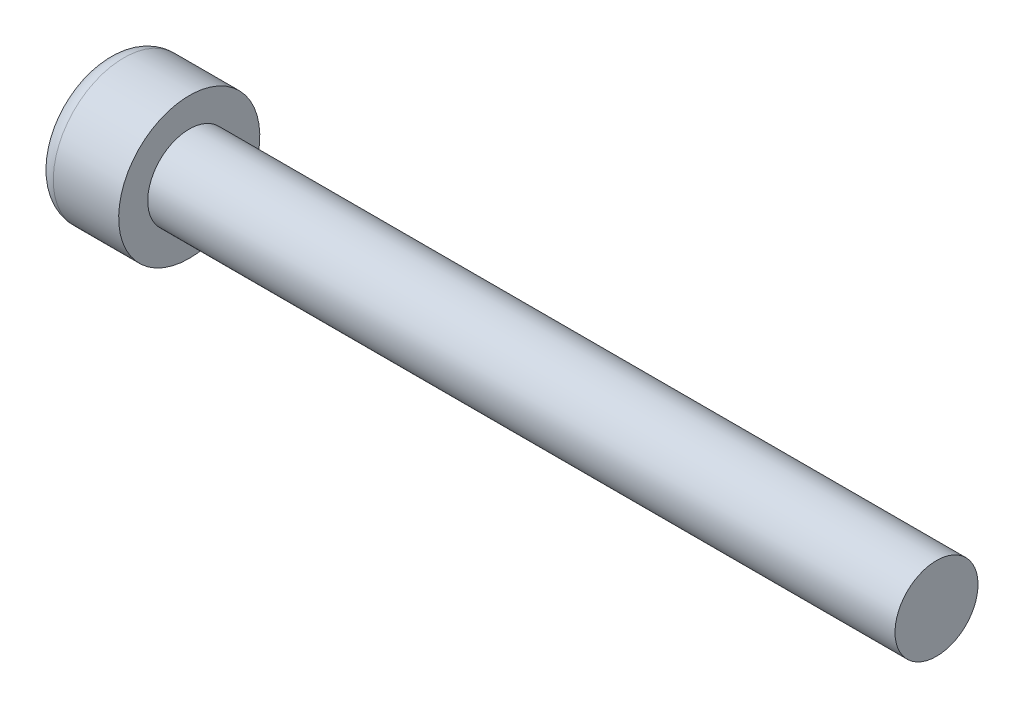
ISO-10303-21;
HEADER;
FILE_DESCRIPTION(('STEP AP214'),'2;1');
FILE_NAME('part.step','',(''),(''),'','','');
FILE_SCHEMA(('AUTOMOTIVE_DESIGN { 1 0 10303 214 1 1 1 1 }'));
ENDSEC;
DATA;
#1=APPLICATION_CONTEXT('core data for automotive mechanical design processes');
#2=APPLICATION_PROTOCOL_DEFINITION('international standard','automotive_design',2000,#1);
#3=PRODUCT_CONTEXT('',#1,'mechanical');
#4=PRODUCT('Part','Part','',(#3));
#5=PRODUCT_RELATED_PRODUCT_CATEGORY('part','',(#4));
#6=PRODUCT_DEFINITION_FORMATION('','',#4);
#7=PRODUCT_DEFINITION_CONTEXT('part definition',#1,'design');
#8=PRODUCT_DEFINITION('design','',#6,#7);
#9=PRODUCT_DEFINITION_SHAPE('','',#8);
#10=(LENGTH_UNIT() NAMED_UNIT(*) SI_UNIT(.MILLI.,.METRE.));
#11=(NAMED_UNIT(*) PLANE_ANGLE_UNIT() SI_UNIT($,.RADIAN.));
#12=(NAMED_UNIT(*) SI_UNIT($,.STERADIAN.) SOLID_ANGLE_UNIT());
#13=UNCERTAINTY_MEASURE_WITH_UNIT(LENGTH_MEASURE(1.E-05),#10,'distance_accuracy_value','');
#14=(GEOMETRIC_REPRESENTATION_CONTEXT(3) GLOBAL_UNCERTAINTY_ASSIGNED_CONTEXT((#13)) GLOBAL_UNIT_ASSIGNED_CONTEXT((#10,
#11,#12)) REPRESENTATION_CONTEXT('',''));
#15=CARTESIAN_POINT('',(0.,0.,0.));
#16=DIRECTION('',(0.,0.,1.));
#17=DIRECTION('',(1.,0.,0.));
#18=AXIS2_PLACEMENT_3D('',#15,#16,#17);
#19=CARTESIAN_POINT('',(0.,0.,0.));
#20=DIRECTION('',(1.,0.,0.));
#21=DIRECTION('',(0.,1.,0.));
#22=AXIS2_PLACEMENT_3D('',#19,#20,#21);
#23=PLANE('',#22);
#24=DIRECTION('',(0.,-0.5,-0.866025403784439));
#25=VECTOR('',#24,1.);
#26=CARTESIAN_POINT('',(0.,2.3094010767585,0.));
#27=LINE('',#26,#25);
#28=CARTESIAN_POINT('',(0.,2.3094010767585,0.));
#29=VERTEX_POINT('',#28);
#30=CARTESIAN_POINT('',(0.,1.15470053837925,-2.));
#31=VERTEX_POINT('',#30);
#32=EDGE_CURVE('E121',#29,#31,#27,.T.);
#33=ORIENTED_EDGE('',*,*,#32,.F.);
#34=DIRECTION('',(0.,0.5,-0.866025403784439));
#35=VECTOR('',#34,1.);
#36=CARTESIAN_POINT('',(0.,1.15470053837925,2.));
#37=LINE('',#36,#35);
#38=CARTESIAN_POINT('',(0.,1.15470053837925,2.));
#39=VERTEX_POINT('',#38);
#40=EDGE_CURVE('E47',#39,#29,#37,.T.);
#41=ORIENTED_EDGE('',*,*,#40,.F.);
#42=DIRECTION('',(0.,1.,0.));
#43=VECTOR('',#42,1.);
#44=CARTESIAN_POINT('',(0.,-1.15470053837925,2.));
#45=LINE('',#44,#43);
#46=CARTESIAN_POINT('',(0.,-1.15470053837925,2.));
#47=VERTEX_POINT('',#46);
#48=EDGE_CURVE('E130',#47,#39,#45,.T.);
#49=ORIENTED_EDGE('',*,*,#48,.F.);
#50=DIRECTION('',(0.,0.5,0.866025403784439));
#51=VECTOR('',#50,1.);
#52=CARTESIAN_POINT('',(0.,-2.3094010767585,0.));
#53=LINE('',#52,#51);
#54=CARTESIAN_POINT('',(0.,-2.3094010767585,0.));
#55=VERTEX_POINT('',#54);
#56=EDGE_CURVE('E128',#55,#47,#53,.T.);
#57=ORIENTED_EDGE('',*,*,#56,.F.);
#58=DIRECTION('',(0.,-0.5,0.866025403784439));
#59=VECTOR('',#58,1.);
#60=CARTESIAN_POINT('',(0.,-1.15470053837925,-2.));
#61=LINE('',#60,#59);
#62=CARTESIAN_POINT('',(0.,-1.15470053837925,-2.));
#63=VERTEX_POINT('',#62);
#64=EDGE_CURVE('E95',#63,#55,#61,.T.);
#65=ORIENTED_EDGE('',*,*,#64,.F.);
#66=DIRECTION('',(0.,-1.,0.));
#67=VECTOR('',#66,1.);
#68=CARTESIAN_POINT('',(0.,1.15470053837925,-2.));
#69=LINE('',#68,#67);
#70=EDGE_CURVE('E124',#31,#63,#69,.T.);
#71=ORIENTED_EDGE('',*,*,#70,.F.);
#72=EDGE_LOOP('',(#33,#41,#49,#57,#65,#71));
#73=FACE_BOUND('',#72,.T.);
#74=CARTESIAN_POINT('',(0.,0.,0.));
#75=DIRECTION('',(-1.,0.,0.));
#76=DIRECTION('',(0.,-1.,0.));
#77=AXIS2_PLACEMENT_3D('',#74,#75,#76);
#78=CIRCLE('',#77,3.1875);
#79=CARTESIAN_POINT('',(0.,-3.1875,0.));
#80=VERTEX_POINT('',#79);
#81=EDGE_CURVE('E11',#80,#80,#78,.T.);
#82=ORIENTED_EDGE('',*,*,#81,.T.);
#83=EDGE_LOOP('',(#82));
#84=FACE_BOUND('',#83,.T.);
#85=ADVANCED_FACE('F33',(#73,#84),#23,.F.);
#86=CARTESIAN_POINT('',(1.0625,0.,0.));
#87=DIRECTION('',(-1.,0.,0.));
#88=DIRECTION('',(0.,-1.,0.));
#89=AXIS2_PLACEMENT_3D('',#86,#87,#88);
#90=TOROIDAL_SURFACE('',#89,3.1875,1.0625);
#91=ORIENTED_EDGE('',*,*,#81,.F.);
#92=EDGE_LOOP('',(#91));
#93=FACE_BOUND('',#92,.T.);
#94=CARTESIAN_POINT('',(1.0625,0.,0.));
#95=DIRECTION('',(-1.,0.,0.));
#96=DIRECTION('',(0.,-1.,0.));
#97=AXIS2_PLACEMENT_3D('',#94,#95,#96);
#98=CIRCLE('',#97,4.25);
#99=CARTESIAN_POINT('',(1.0625,-4.25,0.));
#100=VERTEX_POINT('',#99);
#101=EDGE_CURVE('E40',#100,#100,#98,.T.);
#102=ORIENTED_EDGE('',*,*,#101,.T.);
#103=EDGE_LOOP('',(#102));
#104=FACE_BOUND('',#103,.T.);
#105=ADVANCED_FACE('F150',(#93,#104),#90,.T.);
#106=CARTESIAN_POINT('',(0.,0.,0.));
#107=DIRECTION('',(-1.,0.,0.));
#108=DIRECTION('',(0.,-1.,0.));
#109=AXIS2_PLACEMENT_3D('',#106,#107,#108);
#110=CYLINDRICAL_SURFACE('',#109,4.25);
#111=ORIENTED_EDGE('',*,*,#101,.F.);
#112=EDGE_LOOP('',(#111));
#113=FACE_BOUND('',#112,.T.);
#114=CARTESIAN_POINT('',(5.,0.,0.));
#115=DIRECTION('',(-1.,0.,0.));
#116=DIRECTION('',(0.,-1.,0.));
#117=AXIS2_PLACEMENT_3D('',#114,#115,#116);
#118=CIRCLE('',#117,4.25);
#119=CARTESIAN_POINT('',(5.,-4.25,0.));
#120=VERTEX_POINT('',#119);
#121=EDGE_CURVE('E145',#120,#120,#118,.T.);
#122=ORIENTED_EDGE('',*,*,#121,.T.);
#123=EDGE_LOOP('',(#122));
#124=FACE_BOUND('',#123,.T.);
#125=ADVANCED_FACE('F152',(#113,#124),#110,.T.);
#126=CARTESIAN_POINT('',(5.,4.25,0.));
#127=DIRECTION('',(-1.,0.,0.));
#128=DIRECTION('',(0.,-1.,0.));
#129=AXIS2_PLACEMENT_3D('',#126,#127,#128);
#130=PLANE('',#129);
#131=ORIENTED_EDGE('',*,*,#121,.F.);
#132=EDGE_LOOP('',(#131));
#133=FACE_BOUND('',#132,.T.);
#134=CARTESIAN_POINT('',(5.,0.,0.));
#135=DIRECTION('',(-1.,0.,0.));
#136=DIRECTION('',(0.,-1.,0.));
#137=AXIS2_PLACEMENT_3D('',#134,#135,#136);
#138=CIRCLE('',#137,2.5);
#139=CARTESIAN_POINT('',(5.,-2.5,0.));
#140=VERTEX_POINT('',#139);
#141=EDGE_CURVE('E142',#140,#140,#138,.T.);
#142=ORIENTED_EDGE('',*,*,#141,.T.);
#143=EDGE_LOOP('',(#142));
#144=FACE_BOUND('',#143,.T.);
#145=ADVANCED_FACE('F155',(#133,#144),#130,.F.);
#146=CARTESIAN_POINT('',(0.,0.,0.));
#147=DIRECTION('',(-1.,0.,0.));
#148=DIRECTION('',(0.,-1.,0.));
#149=AXIS2_PLACEMENT_3D('',#146,#147,#148);
#150=CYLINDRICAL_SURFACE('',#149,2.49999999999999);
#151=ORIENTED_EDGE('',*,*,#141,.F.);
#152=EDGE_LOOP('',(#151));
#153=FACE_BOUND('',#152,.T.);
#154=CARTESIAN_POINT('',(50.,0.,0.));
#155=DIRECTION('',(-1.,0.,0.));
#156=DIRECTION('',(0.,-1.,0.));
#157=AXIS2_PLACEMENT_3D('',#154,#155,#156);
#158=CIRCLE('',#157,2.49999999999999);
#159=CARTESIAN_POINT('',(50.,-2.49999999999998,0.));
#160=VERTEX_POINT('',#159);
#161=EDGE_CURVE('E134',#160,#160,#158,.T.);
#162=ORIENTED_EDGE('',*,*,#161,.T.);
#163=EDGE_LOOP('',(#162));
#164=FACE_BOUND('',#163,.T.);
#165=ADVANCED_FACE('F161',(#153,#164),#150,.T.);
#166=CARTESIAN_POINT('',(50.,2.49999999999999,0.));
#167=DIRECTION('',(-1.,0.,0.));
#168=DIRECTION('',(0.,-1.,0.));
#169=AXIS2_PLACEMENT_3D('',#166,#167,#168);
#170=PLANE('',#169);
#171=ORIENTED_EDGE('',*,*,#161,.F.);
#172=EDGE_LOOP('',(#171));
#173=FACE_BOUND('',#172,.T.);
#174=ADVANCED_FACE('F167',(#173),#170,.F.);
#175=CARTESIAN_POINT('',(2.5,1.15470053837925,2.));
#176=DIRECTION('',(0.,0.866025403784439,0.5));
#177=DIRECTION('',(0.,-0.5,0.866025403784439));
#178=AXIS2_PLACEMENT_3D('',#175,#176,#177);
#179=PLANE('',#178);
#180=ORIENTED_EDGE('',*,*,#40,.T.);
#181=DIRECTION('',(-1.,0.,0.));
#182=VECTOR('',#181,1.);
#183=CARTESIAN_POINT('',(2.5,2.3094010767585,0.));
#184=LINE('',#183,#182);
#185=CARTESIAN_POINT('',(2.5,2.3094010767585,0.));
#186=VERTEX_POINT('',#185);
#187=EDGE_CURVE('E77',#186,#29,#184,.T.);
#188=ORIENTED_EDGE('',*,*,#187,.F.);
#189=DIRECTION('',(0.,0.5,-0.866025403784439));
#190=VECTOR('',#189,1.);
#191=CARTESIAN_POINT('',(2.5,1.15470053837925,2.));
#192=LINE('',#191,#190);
#193=CARTESIAN_POINT('',(2.5,1.15470053837925,2.));
#194=VERTEX_POINT('',#193);
#195=EDGE_CURVE('E132',#194,#186,#192,.T.);
#196=ORIENTED_EDGE('',*,*,#195,.F.);
#197=DIRECTION('',(-1.,0.,0.));
#198=VECTOR('',#197,1.);
#199=CARTESIAN_POINT('',(2.5,1.15470053837925,2.));
#200=LINE('',#199,#198);
#201=EDGE_CURVE('E55',#194,#39,#200,.T.);
#202=ORIENTED_EDGE('',*,*,#201,.T.);
#203=EDGE_LOOP('',(#180,#188,#196,#202));
#204=FACE_BOUND('',#203,.T.);
#205=ADVANCED_FACE('F172',(#204),#179,.F.);
#206=CARTESIAN_POINT('',(2.5,-1.15470053837925,2.));
#207=DIRECTION('',(0.,0.,1.));
#208=DIRECTION('',(1.,0.,0.));
#209=AXIS2_PLACEMENT_3D('',#206,#207,#208);
#210=PLANE('',#209);
#211=ORIENTED_EDGE('',*,*,#48,.T.);
#212=ORIENTED_EDGE('',*,*,#201,.F.);
#213=DIRECTION('',(0.,1.,0.));
#214=VECTOR('',#213,1.);
#215=CARTESIAN_POINT('',(2.5,-1.15470053837925,2.));
#216=LINE('',#215,#214);
#217=CARTESIAN_POINT('',(2.5,-1.15470053837925,2.));
#218=VERTEX_POINT('',#217);
#219=EDGE_CURVE('E107',#218,#194,#216,.T.);
#220=ORIENTED_EDGE('',*,*,#219,.F.);
#221=DIRECTION('',(-1.,0.,0.));
#222=VECTOR('',#221,1.);
#223=CARTESIAN_POINT('',(2.5,-1.15470053837925,2.));
#224=LINE('',#223,#222);
#225=EDGE_CURVE('E99',#218,#47,#224,.T.);
#226=ORIENTED_EDGE('',*,*,#225,.T.);
#227=EDGE_LOOP('',(#211,#212,#220,#226));
#228=FACE_BOUND('',#227,.T.);
#229=ADVANCED_FACE('F177',(#228),#210,.F.);
#230=CARTESIAN_POINT('',(2.5,-2.3094010767585,0.));
#231=DIRECTION('',(0.,-0.866025403784439,0.5));
#232=DIRECTION('',(0.,-0.5,-0.866025403784439));
#233=AXIS2_PLACEMENT_3D('',#230,#231,#232);
#234=PLANE('',#233);
#235=ORIENTED_EDGE('',*,*,#56,.T.);
#236=ORIENTED_EDGE('',*,*,#225,.F.);
#237=DIRECTION('',(0.,0.5,0.866025403784439));
#238=VECTOR('',#237,1.);
#239=CARTESIAN_POINT('',(2.5,-2.3094010767585,0.));
#240=LINE('',#239,#238);
#241=CARTESIAN_POINT('',(2.5,-2.3094010767585,0.));
#242=VERTEX_POINT('',#241);
#243=EDGE_CURVE('E103',#242,#218,#240,.T.);
#244=ORIENTED_EDGE('',*,*,#243,.F.);
#245=DIRECTION('',(-1.,0.,0.));
#246=VECTOR('',#245,1.);
#247=CARTESIAN_POINT('',(2.5,-2.3094010767585,0.));
#248=LINE('',#247,#246);
#249=EDGE_CURVE('E88',#242,#55,#248,.T.);
#250=ORIENTED_EDGE('',*,*,#249,.T.);
#251=EDGE_LOOP('',(#235,#236,#244,#250));
#252=FACE_BOUND('',#251,.T.);
#253=ADVANCED_FACE('F104',(#252),#234,.F.);
#254=CARTESIAN_POINT('',(2.5,-1.15470053837925,-2.));
#255=DIRECTION('',(0.,-0.866025403784438,-0.5));
#256=DIRECTION('',(0.,0.5,-0.866025403784438));
#257=AXIS2_PLACEMENT_3D('',#254,#255,#256);
#258=PLANE('',#257);
#259=ORIENTED_EDGE('',*,*,#64,.T.);
#260=ORIENTED_EDGE('',*,*,#249,.F.);
#261=DIRECTION('',(0.,-0.5,0.866025403784439));
#262=VECTOR('',#261,1.);
#263=CARTESIAN_POINT('',(2.5,-1.15470053837925,-2.));
#264=LINE('',#263,#262);
#265=CARTESIAN_POINT('',(2.5,-1.15470053837925,-2.));
#266=VERTEX_POINT('',#265);
#267=EDGE_CURVE('E92',#266,#242,#264,.T.);
#268=ORIENTED_EDGE('',*,*,#267,.F.);
#269=DIRECTION('',(-1.,0.,0.));
#270=VECTOR('',#269,1.);
#271=CARTESIAN_POINT('',(2.5,-1.15470053837925,-2.));
#272=LINE('',#271,#270);
#273=EDGE_CURVE('E100',#266,#63,#272,.T.);
#274=ORIENTED_EDGE('',*,*,#273,.T.);
#275=EDGE_LOOP('',(#259,#260,#268,#274));
#276=FACE_BOUND('',#275,.T.);
#277=ADVANCED_FACE('F90',(#276),#258,.F.);
#278=CARTESIAN_POINT('',(2.5,1.15470053837925,-2.));
#279=DIRECTION('',(0.,0.,-1.));
#280=DIRECTION('',(-1.,0.,0.));
#281=AXIS2_PLACEMENT_3D('',#278,#279,#280);
#282=PLANE('',#281);
#283=ORIENTED_EDGE('',*,*,#70,.T.);
#284=ORIENTED_EDGE('',*,*,#273,.F.);
#285=DIRECTION('',(0.,-1.,0.));
#286=VECTOR('',#285,1.);
#287=CARTESIAN_POINT('',(2.5,1.15470053837925,-2.));
#288=LINE('',#287,#286);
#289=CARTESIAN_POINT('',(2.5,1.15470053837925,-2.));
#290=VERTEX_POINT('',#289);
#291=EDGE_CURVE('E113',#290,#266,#288,.T.);
#292=ORIENTED_EDGE('',*,*,#291,.F.);
#293=DIRECTION('',(-1.,0.,0.));
#294=VECTOR('',#293,1.);
#295=CARTESIAN_POINT('',(2.5,1.15470053837925,-2.));
#296=LINE('',#295,#294);
#297=EDGE_CURVE('E137',#290,#31,#296,.T.);
#298=ORIENTED_EDGE('',*,*,#297,.T.);
#299=EDGE_LOOP('',(#283,#284,#292,#298));
#300=FACE_BOUND('',#299,.T.);
#301=ADVANCED_FACE('F203',(#300),#282,.F.);
#302=CARTESIAN_POINT('',(2.5,2.3094010767585,0.));
#303=DIRECTION('',(0.,0.866025403784439,-0.5));
#304=DIRECTION('',(0.,0.5,0.866025403784439));
#305=AXIS2_PLACEMENT_3D('',#302,#303,#304);
#306=PLANE('',#305);
#307=ORIENTED_EDGE('',*,*,#32,.T.);
#308=ORIENTED_EDGE('',*,*,#297,.F.);
#309=DIRECTION('',(0.,-0.5,-0.866025403784439));
#310=VECTOR('',#309,1.);
#311=CARTESIAN_POINT('',(2.5,2.3094010767585,0.));
#312=LINE('',#311,#310);
#313=EDGE_CURVE('E115',#186,#290,#312,.T.);
#314=ORIENTED_EDGE('',*,*,#313,.F.);
#315=ORIENTED_EDGE('',*,*,#187,.T.);
#316=EDGE_LOOP('',(#307,#308,#314,#315));
#317=FACE_BOUND('',#316,.T.);
#318=ADVANCED_FACE('F191',(#317),#306,.F.);
#319=CARTESIAN_POINT('',(2.5,0.,0.));
#320=DIRECTION('',(-1.,0.,0.));
#321=DIRECTION('',(0.,-1.,0.));
#322=AXIS2_PLACEMENT_3D('',#319,#320,#321);
#323=PLANE('',#322);
#324=ORIENTED_EDGE('',*,*,#195,.T.);
#325=ORIENTED_EDGE('',*,*,#313,.T.);
#326=ORIENTED_EDGE('',*,*,#291,.T.);
#327=ORIENTED_EDGE('',*,*,#267,.T.);
#328=ORIENTED_EDGE('',*,*,#243,.T.);
#329=ORIENTED_EDGE('',*,*,#219,.T.);
#330=EDGE_LOOP('',(#324,#325,#326,#327,#328,#329));
#331=FACE_BOUND('',#330,.T.);
#332=ADVANCED_FACE('F110',(#331),#323,.T.);
#333=CLOSED_SHELL('',(#85,#105,#125,#145,#165,#174,#205,#229,#253,#277,#301,#318,#332));
#334=MANIFOLD_SOLID_BREP('B2',#333);
#335=ADVANCED_BREP_SHAPE_REPRESENTATION('',(#18,#334),#14);
#336=SHAPE_DEFINITION_REPRESENTATION(#9,#335);
ENDSEC;
END-ISO-10303-21;
